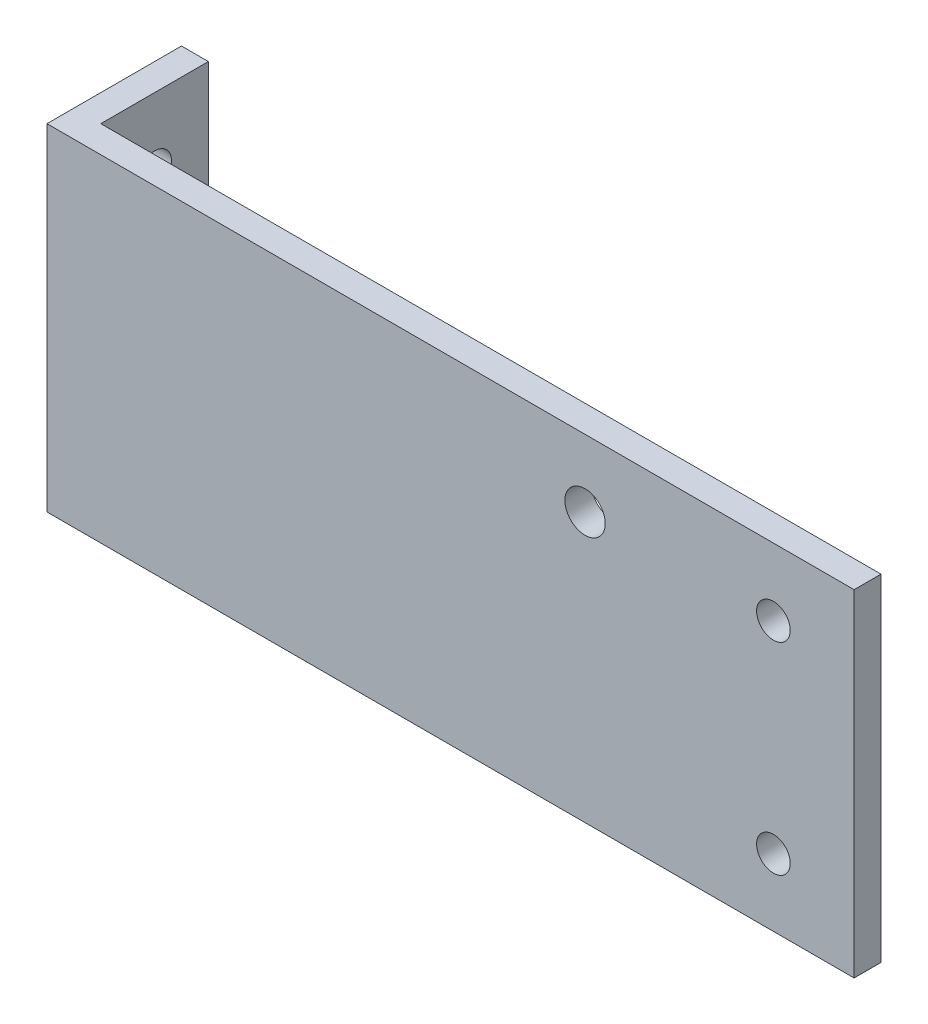
ISO-10303-21;
HEADER;
FILE_DESCRIPTION(('STEP AP214'),'2;1');
FILE_NAME('part.step','',(''),(''),'','','');
FILE_SCHEMA(('AUTOMOTIVE_DESIGN { 1 0 10303 214 1 1 1 1 }'));
ENDSEC;
DATA;
#1=APPLICATION_CONTEXT('core data for automotive mechanical design processes');
#2=APPLICATION_PROTOCOL_DEFINITION('international standard','automotive_design',2000,#1);
#3=PRODUCT_CONTEXT('',#1,'mechanical');
#4=PRODUCT('Part','Part','',(#3));
#5=PRODUCT_RELATED_PRODUCT_CATEGORY('part','',(#4));
#6=PRODUCT_DEFINITION_FORMATION('','',#4);
#7=PRODUCT_DEFINITION_CONTEXT('part definition',#1,'design');
#8=PRODUCT_DEFINITION('design','',#6,#7);
#9=PRODUCT_DEFINITION_SHAPE('','',#8);
#10=(LENGTH_UNIT() NAMED_UNIT(*) SI_UNIT(.MILLI.,.METRE.));
#11=(NAMED_UNIT(*) PLANE_ANGLE_UNIT() SI_UNIT($,.RADIAN.));
#12=(NAMED_UNIT(*) SI_UNIT($,.STERADIAN.) SOLID_ANGLE_UNIT());
#13=UNCERTAINTY_MEASURE_WITH_UNIT(LENGTH_MEASURE(1.E-05),#10,'distance_accuracy_value','');
#14=(GEOMETRIC_REPRESENTATION_CONTEXT(3) GLOBAL_UNCERTAINTY_ASSIGNED_CONTEXT((#13)) GLOBAL_UNIT_ASSIGNED_CONTEXT((#10,
#11,#12)) REPRESENTATION_CONTEXT('',''));
#15=CARTESIAN_POINT('',(0.,0.,0.));
#16=DIRECTION('',(0.,0.,1.));
#17=DIRECTION('',(1.,0.,0.));
#18=AXIS2_PLACEMENT_3D('',#15,#16,#17);
#19=CARTESIAN_POINT('',(0.,50.,0.));
#20=DIRECTION('',(0.,0.,-1.));
#21=DIRECTION('',(-1.,0.,0.));
#22=AXIS2_PLACEMENT_3D('',#19,#20,#21);
#23=PLANE('',#22);
#24=CARTESIAN_POINT('',(80.,40.,0.));
#25=DIRECTION('',(0.,0.,1.));
#26=DIRECTION('',(1.,0.,0.));
#27=AXIS2_PLACEMENT_3D('',#24,#25,#26);
#28=CIRCLE('',#27,3.00000000000001);
#29=CARTESIAN_POINT('',(83.,40.,0.));
#30=VERTEX_POINT('',#29);
#31=EDGE_CURVE('E156',#30,#30,#28,.T.);
#32=ORIENTED_EDGE('',*,*,#31,.F.);
#33=EDGE_LOOP('',(#32));
#34=FACE_BOUND('',#33,.T.);
#35=CARTESIAN_POINT('',(108.,10.,0.));
#36=DIRECTION('',(0.,0.,1.));
#37=DIRECTION('',(1.,0.,0.));
#38=AXIS2_PLACEMENT_3D('',#35,#36,#37);
#39=CIRCLE('',#38,2.49999999999999);
#40=CARTESIAN_POINT('',(110.5,10.,0.));
#41=VERTEX_POINT('',#40);
#42=EDGE_CURVE('E146',#41,#41,#39,.T.);
#43=ORIENTED_EDGE('',*,*,#42,.F.);
#44=EDGE_LOOP('',(#43));
#45=FACE_BOUND('',#44,.T.);
#46=CARTESIAN_POINT('',(108.,40.,0.));
#47=DIRECTION('',(0.,0.,1.));
#48=DIRECTION('',(1.,0.,0.));
#49=AXIS2_PLACEMENT_3D('',#46,#47,#48);
#50=CIRCLE('',#49,2.5);
#51=CARTESIAN_POINT('',(110.5,40.,0.));
#52=VERTEX_POINT('',#51);
#53=EDGE_CURVE('E143',#52,#52,#50,.T.);
#54=ORIENTED_EDGE('',*,*,#53,.F.);
#55=EDGE_LOOP('',(#54));
#56=FACE_BOUND('',#55,.T.);
#57=DIRECTION('',(1.,0.,0.));
#58=VECTOR('',#57,1.);
#59=CARTESIAN_POINT('',(0.,0.,0.));
#60=LINE('',#59,#58);
#61=CARTESIAN_POINT('',(0.,0.,0.));
#62=VERTEX_POINT('',#61);
#63=CARTESIAN_POINT('',(120.,0.,0.));
#64=VERTEX_POINT('',#63);
#65=EDGE_CURVE('E125',#62,#64,#60,.T.);
#66=ORIENTED_EDGE('',*,*,#65,.T.);
#67=DIRECTION('',(0.,-1.,0.));
#68=VECTOR('',#67,1.);
#69=CARTESIAN_POINT('',(120.,50.,0.));
#70=LINE('',#69,#68);
#71=CARTESIAN_POINT('',(120.,50.,0.));
#72=VERTEX_POINT('',#71);
#73=EDGE_CURVE('E44',#72,#64,#70,.T.);
#74=ORIENTED_EDGE('',*,*,#73,.F.);
#75=DIRECTION('',(1.,0.,0.));
#76=VECTOR('',#75,1.);
#77=CARTESIAN_POINT('',(0.,50.,0.));
#78=LINE('',#77,#76);
#79=CARTESIAN_POINT('',(0.,50.,0.));
#80=VERTEX_POINT('',#79);
#81=EDGE_CURVE('E91',#80,#72,#78,.T.);
#82=ORIENTED_EDGE('',*,*,#81,.F.);
#83=DIRECTION('',(0.,-1.,0.));
#84=VECTOR('',#83,1.);
#85=CARTESIAN_POINT('',(0.,50.,0.));
#86=LINE('',#85,#84);
#87=EDGE_CURVE('E11',#80,#62,#86,.T.);
#88=ORIENTED_EDGE('',*,*,#87,.T.);
#89=EDGE_LOOP('',(#66,#74,#82,#88));
#90=FACE_BOUND('',#89,.T.);
#91=ADVANCED_FACE('F35',(#34,#45,#56,#90),#23,.F.);
#92=CARTESIAN_POINT('',(120.,50.,0.));
#93=DIRECTION('',(-1.,0.,0.));
#94=DIRECTION('',(0.,0.,1.));
#95=AXIS2_PLACEMENT_3D('',#92,#93,#94);
#96=PLANE('',#95);
#97=DIRECTION('',(0.,0.,-1.));
#98=VECTOR('',#97,1.);
#99=CARTESIAN_POINT('',(120.,0.,0.));
#100=LINE('',#99,#98);
#101=CARTESIAN_POINT('',(120.,0.,-4.));
#102=VERTEX_POINT('',#101);
#103=EDGE_CURVE('E127',#64,#102,#100,.T.);
#104=ORIENTED_EDGE('',*,*,#103,.T.);
#105=DIRECTION('',(0.,-1.,0.));
#106=VECTOR('',#105,1.);
#107=CARTESIAN_POINT('',(120.,50.,-4.));
#108=LINE('',#107,#106);
#109=CARTESIAN_POINT('',(120.,50.,-4.));
#110=VERTEX_POINT('',#109);
#111=EDGE_CURVE('E114',#110,#102,#108,.T.);
#112=ORIENTED_EDGE('',*,*,#111,.F.);
#113=DIRECTION('',(0.,0.,-1.));
#114=VECTOR('',#113,1.);
#115=CARTESIAN_POINT('',(120.,50.,0.));
#116=LINE('',#115,#114);
#117=EDGE_CURVE('E105',#72,#110,#116,.T.);
#118=ORIENTED_EDGE('',*,*,#117,.F.);
#119=ORIENTED_EDGE('',*,*,#73,.T.);
#120=EDGE_LOOP('',(#104,#112,#118,#119));
#121=FACE_BOUND('',#120,.T.);
#122=ADVANCED_FACE('F173',(#121),#96,.F.);
#123=CARTESIAN_POINT('',(4.,50.,-4.));
#124=DIRECTION('',(0.,0.,1.));
#125=DIRECTION('',(1.,0.,0.));
#126=AXIS2_PLACEMENT_3D('',#123,#124,#125);
#127=PLANE('',#126);
#128=CARTESIAN_POINT('',(80.,40.,-4.));
#129=DIRECTION('',(0.,0.,1.));
#130=DIRECTION('',(1.,0.,0.));
#131=AXIS2_PLACEMENT_3D('',#128,#129,#130);
#132=CIRCLE('',#131,3.00000000000001);
#133=CARTESIAN_POINT('',(83.,40.,-4.));
#134=VERTEX_POINT('',#133);
#135=EDGE_CURVE('E38',#134,#134,#132,.T.);
#136=ORIENTED_EDGE('',*,*,#135,.T.);
#137=EDGE_LOOP('',(#136));
#138=FACE_BOUND('',#137,.T.);
#139=CARTESIAN_POINT('',(108.,10.,-4.));
#140=DIRECTION('',(0.,0.,1.));
#141=DIRECTION('',(1.,0.,0.));
#142=AXIS2_PLACEMENT_3D('',#139,#140,#141);
#143=CIRCLE('',#142,2.49999999999999);
#144=CARTESIAN_POINT('',(110.5,10.,-4.));
#145=VERTEX_POINT('',#144);
#146=EDGE_CURVE('E144',#145,#145,#143,.T.);
#147=ORIENTED_EDGE('',*,*,#146,.T.);
#148=EDGE_LOOP('',(#147));
#149=FACE_BOUND('',#148,.T.);
#150=CARTESIAN_POINT('',(108.,40.,-4.));
#151=DIRECTION('',(0.,0.,1.));
#152=DIRECTION('',(1.,0.,0.));
#153=AXIS2_PLACEMENT_3D('',#150,#151,#152);
#154=CIRCLE('',#153,2.5);
#155=CARTESIAN_POINT('',(110.5,40.,-4.));
#156=VERTEX_POINT('',#155);
#157=EDGE_CURVE('E140',#156,#156,#154,.T.);
#158=ORIENTED_EDGE('',*,*,#157,.T.);
#159=EDGE_LOOP('',(#158));
#160=FACE_BOUND('',#159,.T.);
#161=DIRECTION('',(-1.,0.,0.));
#162=VECTOR('',#161,1.);
#163=CARTESIAN_POINT('',(4.,0.,-4.));
#164=LINE('',#163,#162);
#165=CARTESIAN_POINT('',(4.,0.,-4.));
#166=VERTEX_POINT('',#165);
#167=EDGE_CURVE('E113',#102,#166,#164,.T.);
#168=ORIENTED_EDGE('',*,*,#167,.T.);
#169=DIRECTION('',(0.,-1.,0.));
#170=VECTOR('',#169,1.);
#171=CARTESIAN_POINT('',(4.,50.,-4.));
#172=LINE('',#171,#170);
#173=CARTESIAN_POINT('',(4.,50.,-4.));
#174=VERTEX_POINT('',#173);
#175=EDGE_CURVE('E110',#174,#166,#172,.T.);
#176=ORIENTED_EDGE('',*,*,#175,.F.);
#177=DIRECTION('',(-1.,0.,0.));
#178=VECTOR('',#177,1.);
#179=CARTESIAN_POINT('',(4.,50.,-4.));
#180=LINE('',#179,#178);
#181=EDGE_CURVE('E99',#110,#174,#180,.T.);
#182=ORIENTED_EDGE('',*,*,#181,.F.);
#183=ORIENTED_EDGE('',*,*,#111,.T.);
#184=EDGE_LOOP('',(#168,#176,#182,#183));
#185=FACE_BOUND('',#184,.T.);
#186=ADVANCED_FACE('F111',(#138,#149,#160,#185),#127,.F.);
#187=CARTESIAN_POINT('',(4.,50.,-4.));
#188=DIRECTION('',(-1.,0.,0.));
#189=DIRECTION('',(0.,0.,1.));
#190=AXIS2_PLACEMENT_3D('',#187,#188,#189);
#191=PLANE('',#190);
#192=CARTESIAN_POINT('',(4.,10.,-12.));
#193=DIRECTION('',(-1.,0.,0.));
#194=DIRECTION('',(0.,0.,1.));
#195=AXIS2_PLACEMENT_3D('',#192,#193,#194);
#196=CIRCLE('',#195,2.5);
#197=CARTESIAN_POINT('',(4.,10.,-9.5));
#198=VERTEX_POINT('',#197);
#199=EDGE_CURVE('E161',#198,#198,#196,.T.);
#200=ORIENTED_EDGE('',*,*,#199,.T.);
#201=EDGE_LOOP('',(#200));
#202=FACE_BOUND('',#201,.T.);
#203=CARTESIAN_POINT('',(4.,40.,-12.));
#204=DIRECTION('',(-1.,0.,0.));
#205=DIRECTION('',(0.,0.,1.));
#206=AXIS2_PLACEMENT_3D('',#203,#204,#205);
#207=CIRCLE('',#206,2.5);
#208=CARTESIAN_POINT('',(4.,40.,-9.5));
#209=VERTEX_POINT('',#208);
#210=EDGE_CURVE('E128',#209,#209,#207,.T.);
#211=ORIENTED_EDGE('',*,*,#210,.T.);
#212=EDGE_LOOP('',(#211));
#213=FACE_BOUND('',#212,.T.);
#214=DIRECTION('',(0.,0.,-1.));
#215=VECTOR('',#214,1.);
#216=CARTESIAN_POINT('',(4.,0.,-4.));
#217=LINE('',#216,#215);
#218=CARTESIAN_POINT('',(4.,0.,-20.));
#219=VERTEX_POINT('',#218);
#220=EDGE_CURVE('E77',#166,#219,#217,.T.);
#221=ORIENTED_EDGE('',*,*,#220,.T.);
#222=DIRECTION('',(0.,-1.,0.));
#223=VECTOR('',#222,1.);
#224=CARTESIAN_POINT('',(4.,50.,-20.));
#225=LINE('',#224,#223);
#226=CARTESIAN_POINT('',(4.,50.,-20.));
#227=VERTEX_POINT('',#226);
#228=EDGE_CURVE('E115',#227,#219,#225,.T.);
#229=ORIENTED_EDGE('',*,*,#228,.F.);
#230=DIRECTION('',(0.,0.,-1.));
#231=VECTOR('',#230,1.);
#232=CARTESIAN_POINT('',(4.,50.,-4.));
#233=LINE('',#232,#231);
#234=EDGE_CURVE('E103',#174,#227,#233,.T.);
#235=ORIENTED_EDGE('',*,*,#234,.F.);
#236=ORIENTED_EDGE('',*,*,#175,.T.);
#237=EDGE_LOOP('',(#221,#229,#235,#236));
#238=FACE_BOUND('',#237,.T.);
#239=ADVANCED_FACE('F117',(#202,#213,#238),#191,.F.);
#240=CARTESIAN_POINT('',(0.,50.,-20.));
#241=DIRECTION('',(0.,0.,1.));
#242=DIRECTION('',(1.,0.,0.));
#243=AXIS2_PLACEMENT_3D('',#240,#241,#242);
#244=PLANE('',#243);
#245=DIRECTION('',(-1.,0.,0.));
#246=VECTOR('',#245,1.);
#247=CARTESIAN_POINT('',(0.,0.,-20.));
#248=LINE('',#247,#246);
#249=CARTESIAN_POINT('',(0.,0.,-20.));
#250=VERTEX_POINT('',#249);
#251=EDGE_CURVE('E84',#219,#250,#248,.T.);
#252=ORIENTED_EDGE('',*,*,#251,.T.);
#253=DIRECTION('',(0.,-1.,0.));
#254=VECTOR('',#253,1.);
#255=CARTESIAN_POINT('',(0.,50.,-20.));
#256=LINE('',#255,#254);
#257=CARTESIAN_POINT('',(0.,50.,-20.));
#258=VERTEX_POINT('',#257);
#259=EDGE_CURVE('E121',#258,#250,#256,.T.);
#260=ORIENTED_EDGE('',*,*,#259,.F.);
#261=DIRECTION('',(-1.,0.,0.));
#262=VECTOR('',#261,1.);
#263=CARTESIAN_POINT('',(0.,50.,-20.));
#264=LINE('',#263,#262);
#265=EDGE_CURVE('E119',#227,#258,#264,.T.);
#266=ORIENTED_EDGE('',*,*,#265,.F.);
#267=ORIENTED_EDGE('',*,*,#228,.T.);
#268=EDGE_LOOP('',(#252,#260,#266,#267));
#269=FACE_BOUND('',#268,.T.);
#270=ADVANCED_FACE('F178',(#269),#244,.F.);
#271=CARTESIAN_POINT('',(0.,50.,-4.));
#272=DIRECTION('',(1.,0.,0.));
#273=DIRECTION('',(0.,0.,-1.));
#274=AXIS2_PLACEMENT_3D('',#271,#272,#273);
#275=PLANE('',#274);
#276=CARTESIAN_POINT('',(0.,10.,-12.));
#277=DIRECTION('',(-1.,0.,0.));
#278=DIRECTION('',(0.,0.,1.));
#279=AXIS2_PLACEMENT_3D('',#276,#277,#278);
#280=CIRCLE('',#279,2.5);
#281=CARTESIAN_POINT('',(0.,10.,-9.5));
#282=VERTEX_POINT('',#281);
#283=EDGE_CURVE('E142',#282,#282,#280,.T.);
#284=ORIENTED_EDGE('',*,*,#283,.F.);
#285=EDGE_LOOP('',(#284));
#286=FACE_BOUND('',#285,.T.);
#287=CARTESIAN_POINT('',(0.,40.,-12.));
#288=DIRECTION('',(-1.,0.,0.));
#289=DIRECTION('',(0.,0.,1.));
#290=AXIS2_PLACEMENT_3D('',#287,#288,#289);
#291=CIRCLE('',#290,2.5);
#292=CARTESIAN_POINT('',(0.,40.,-9.5));
#293=VERTEX_POINT('',#292);
#294=EDGE_CURVE('E164',#293,#293,#291,.T.);
#295=ORIENTED_EDGE('',*,*,#294,.F.);
#296=EDGE_LOOP('',(#295));
#297=FACE_BOUND('',#296,.T.);
#298=DIRECTION('',(0.,0.,1.));
#299=VECTOR('',#298,1.);
#300=CARTESIAN_POINT('',(0.,0.,-4.));
#301=LINE('',#300,#299);
#302=EDGE_CURVE('E133',#250,#62,#301,.T.);
#303=ORIENTED_EDGE('',*,*,#302,.T.);
#304=ORIENTED_EDGE('',*,*,#87,.F.);
#305=DIRECTION('',(0.,0.,1.));
#306=VECTOR('',#305,1.);
#307=CARTESIAN_POINT('',(0.,50.,0.));
#308=LINE('',#307,#306);
#309=EDGE_CURVE('E53',#258,#80,#308,.T.);
#310=ORIENTED_EDGE('',*,*,#309,.F.);
#311=ORIENTED_EDGE('',*,*,#259,.T.);
#312=EDGE_LOOP('',(#303,#304,#310,#311));
#313=FACE_BOUND('',#312,.T.);
#314=ADVANCED_FACE('F177',(#286,#297,#313),#275,.F.);
#315=CARTESIAN_POINT('',(0.,50.,0.));
#316=DIRECTION('',(0.,-1.,0.));
#317=DIRECTION('',(0.,0.,-1.));
#318=AXIS2_PLACEMENT_3D('',#315,#316,#317);
#319=PLANE('',#318);
#320=ORIENTED_EDGE('',*,*,#309,.T.);
#321=ORIENTED_EDGE('',*,*,#81,.T.);
#322=ORIENTED_EDGE('',*,*,#117,.T.);
#323=ORIENTED_EDGE('',*,*,#181,.T.);
#324=ORIENTED_EDGE('',*,*,#234,.T.);
#325=ORIENTED_EDGE('',*,*,#265,.T.);
#326=EDGE_LOOP('',(#320,#321,#322,#323,#324,#325));
#327=FACE_BOUND('',#326,.T.);
#328=ADVANCED_FACE('F101',(#327),#319,.F.);
#329=CARTESIAN_POINT('',(0.,0.,0.));
#330=DIRECTION('',(0.,-1.,0.));
#331=DIRECTION('',(0.,0.,-1.));
#332=AXIS2_PLACEMENT_3D('',#329,#330,#331);
#333=PLANE('',#332);
#334=ORIENTED_EDGE('',*,*,#65,.F.);
#335=ORIENTED_EDGE('',*,*,#302,.F.);
#336=ORIENTED_EDGE('',*,*,#251,.F.);
#337=ORIENTED_EDGE('',*,*,#220,.F.);
#338=ORIENTED_EDGE('',*,*,#167,.F.);
#339=ORIENTED_EDGE('',*,*,#103,.F.);
#340=EDGE_LOOP('',(#334,#335,#336,#337,#338,#339));
#341=FACE_BOUND('',#340,.T.);
#342=ADVANCED_FACE('F175',(#341),#333,.T.);
#343=CARTESIAN_POINT('',(10.,40.,-12.));
#344=DIRECTION('',(-1.,0.,0.));
#345=DIRECTION('',(0.,0.,1.));
#346=AXIS2_PLACEMENT_3D('',#343,#344,#345);
#347=CYLINDRICAL_SURFACE('',#346,2.5);
#348=ORIENTED_EDGE('',*,*,#294,.T.);
#349=EDGE_LOOP('',(#348));
#350=FACE_BOUND('',#349,.T.);
#351=ORIENTED_EDGE('',*,*,#210,.F.);
#352=EDGE_LOOP('',(#351));
#353=FACE_BOUND('',#352,.T.);
#354=ADVANCED_FACE('F226',(#350,#353),#347,.F.);
#355=CARTESIAN_POINT('',(10.,10.,-12.));
#356=DIRECTION('',(-1.,0.,0.));
#357=DIRECTION('',(0.,0.,1.));
#358=AXIS2_PLACEMENT_3D('',#355,#356,#357);
#359=CYLINDRICAL_SURFACE('',#358,2.5);
#360=ORIENTED_EDGE('',*,*,#283,.T.);
#361=EDGE_LOOP('',(#360));
#362=FACE_BOUND('',#361,.T.);
#363=ORIENTED_EDGE('',*,*,#199,.F.);
#364=EDGE_LOOP('',(#363));
#365=FACE_BOUND('',#364,.T.);
#366=ADVANCED_FACE('F204',(#362,#365),#359,.F.);
#367=CARTESIAN_POINT('',(108.,40.,-10.));
#368=DIRECTION('',(0.,0.,1.));
#369=DIRECTION('',(1.,0.,0.));
#370=AXIS2_PLACEMENT_3D('',#367,#368,#369);
#371=CYLINDRICAL_SURFACE('',#370,2.5);
#372=ORIENTED_EDGE('',*,*,#53,.T.);
#373=EDGE_LOOP('',(#372));
#374=FACE_BOUND('',#373,.T.);
#375=ORIENTED_EDGE('',*,*,#157,.F.);
#376=EDGE_LOOP('',(#375));
#377=FACE_BOUND('',#376,.T.);
#378=ADVANCED_FACE('F200',(#374,#377),#371,.F.);
#379=CARTESIAN_POINT('',(108.,10.,-10.));
#380=DIRECTION('',(0.,0.,1.));
#381=DIRECTION('',(1.,0.,0.));
#382=AXIS2_PLACEMENT_3D('',#379,#380,#381);
#383=CYLINDRICAL_SURFACE('',#382,2.49999999999999);
#384=ORIENTED_EDGE('',*,*,#42,.T.);
#385=EDGE_LOOP('',(#384));
#386=FACE_BOUND('',#385,.T.);
#387=ORIENTED_EDGE('',*,*,#146,.F.);
#388=EDGE_LOOP('',(#387));
#389=FACE_BOUND('',#388,.T.);
#390=ADVANCED_FACE('F203',(#386,#389),#383,.F.);
#391=CARTESIAN_POINT('',(80.,40.,-10.));
#392=DIRECTION('',(0.,0.,1.));
#393=DIRECTION('',(1.,0.,0.));
#394=AXIS2_PLACEMENT_3D('',#391,#392,#393);
#395=CYLINDRICAL_SURFACE('',#394,3.00000000000001);
#396=ORIENTED_EDGE('',*,*,#31,.T.);
#397=EDGE_LOOP('',(#396));
#398=FACE_BOUND('',#397,.T.);
#399=ORIENTED_EDGE('',*,*,#135,.F.);
#400=EDGE_LOOP('',(#399));
#401=FACE_BOUND('',#400,.T.);
#402=ADVANCED_FACE('F215',(#398,#401),#395,.F.);
#403=CLOSED_SHELL('',(#91,#122,#186,#239,#270,#314,#328,#342,#354,#366,#378,#390,#402));
#404=MANIFOLD_SOLID_BREP('B2',#403);
#405=ADVANCED_BREP_SHAPE_REPRESENTATION('',(#18,#404),#14);
#406=SHAPE_DEFINITION_REPRESENTATION(#9,#405);
ENDSEC;
END-ISO-10303-21;
